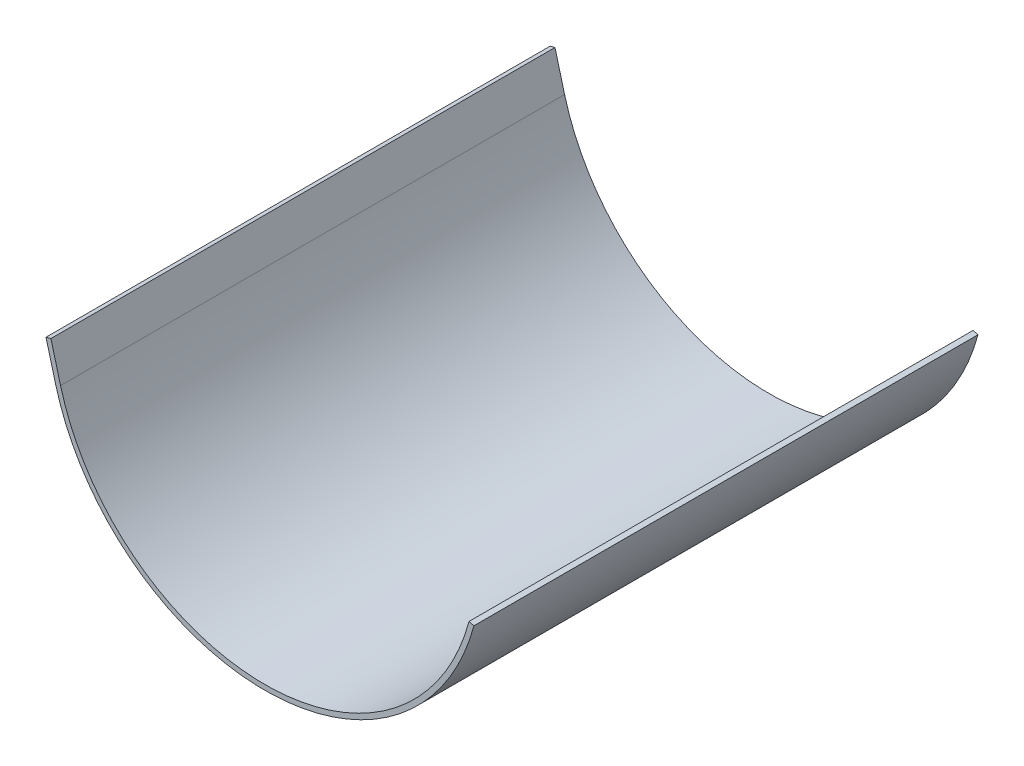
ISO-10303-21;
HEADER;
FILE_DESCRIPTION(('STEP AP214'),'2;1');
FILE_NAME('part.step','',(''),(''),'','','');
FILE_SCHEMA(('AUTOMOTIVE_DESIGN { 1 0 10303 214 1 1 1 1 }'));
ENDSEC;
DATA;
#1=APPLICATION_CONTEXT('core data for automotive mechanical design processes');
#2=APPLICATION_PROTOCOL_DEFINITION('international standard','automotive_design',2000,#1);
#3=PRODUCT_CONTEXT('',#1,'mechanical');
#4=PRODUCT('Part','Part','',(#3));
#5=PRODUCT_RELATED_PRODUCT_CATEGORY('part','',(#4));
#6=PRODUCT_DEFINITION_FORMATION('','',#4);
#7=PRODUCT_DEFINITION_CONTEXT('part definition',#1,'design');
#8=PRODUCT_DEFINITION('design','',#6,#7);
#9=PRODUCT_DEFINITION_SHAPE('','',#8);
#10=(LENGTH_UNIT() NAMED_UNIT(*) SI_UNIT(.MILLI.,.METRE.));
#11=(NAMED_UNIT(*) PLANE_ANGLE_UNIT() SI_UNIT($,.RADIAN.));
#12=(NAMED_UNIT(*) SI_UNIT($,.STERADIAN.) SOLID_ANGLE_UNIT());
#13=UNCERTAINTY_MEASURE_WITH_UNIT(LENGTH_MEASURE(1.E-05),#10,'distance_accuracy_value','');
#14=(GEOMETRIC_REPRESENTATION_CONTEXT(3) GLOBAL_UNCERTAINTY_ASSIGNED_CONTEXT((#13)) GLOBAL_UNIT_ASSIGNED_CONTEXT((#10,
#11,#12)) REPRESENTATION_CONTEXT('',''));
#15=CARTESIAN_POINT('',(0.,0.,0.));
#16=DIRECTION('',(0.,0.,1.));
#17=DIRECTION('',(1.,0.,0.));
#18=AXIS2_PLACEMENT_3D('',#15,#16,#17);
#19=CARTESIAN_POINT('',(0.,0.,74.5));
#20=DIRECTION('',(0.,0.,-1.));
#21=DIRECTION('',(-1.,0.,0.));
#22=AXIS2_PLACEMENT_3D('',#19,#20,#21);
#23=CYLINDRICAL_SURFACE('',#22,62.5);
#24=CARTESIAN_POINT('',(0.,0.,-74.5));
#25=DIRECTION('',(0.,0.,-1.));
#26=DIRECTION('',(1.,0.,0.));
#27=AXIS2_PLACEMENT_3D('',#24,#25,#26);
#28=CIRCLE('',#27,62.5);
#29=CARTESIAN_POINT('',(60.3703641430668,-16.1761903189075,-74.5));
#30=VERTEX_POINT('',#29);
#31=CARTESIAN_POINT('',(-60.3703641430668,-16.1761903189075,-74.5));
#32=VERTEX_POINT('',#31);
#33=EDGE_CURVE('E114',#30,#32,#28,.T.);
#34=ORIENTED_EDGE('',*,*,#33,.T.);
#35=DIRECTION('',(0.,0.,-1.));
#36=VECTOR('',#35,1.);
#37=CARTESIAN_POINT('',(-60.3703641430668,-16.1761903189075,74.5));
#38=LINE('',#37,#36);
#39=CARTESIAN_POINT('',(-60.3703641430668,-16.1761903189075,74.5));
#40=VERTEX_POINT('',#39);
#41=EDGE_CURVE('E11',#40,#32,#38,.T.);
#42=ORIENTED_EDGE('',*,*,#41,.F.);
#43=CARTESIAN_POINT('',(0.,0.,74.5));
#44=DIRECTION('',(0.,0.,-1.));
#45=DIRECTION('',(1.,0.,0.));
#46=AXIS2_PLACEMENT_3D('',#43,#44,#45);
#47=CIRCLE('',#46,62.5);
#48=CARTESIAN_POINT('',(60.3703641430668,-16.1761903189075,74.5));
#49=VERTEX_POINT('',#48);
#50=EDGE_CURVE('E75',#49,#40,#47,.T.);
#51=ORIENTED_EDGE('',*,*,#50,.F.);
#52=DIRECTION('',(0.,0.,-1.));
#53=VECTOR('',#52,1.);
#54=CARTESIAN_POINT('',(60.3703641430668,-16.1761903189075,74.5));
#55=LINE('',#54,#53);
#56=EDGE_CURVE('E124',#49,#30,#55,.T.);
#57=ORIENTED_EDGE('',*,*,#56,.T.);
#58=EDGE_LOOP('',(#34,#42,#51,#57));
#59=FACE_BOUND('',#58,.T.);
#60=ADVANCED_FACE('F33',(#59),#23,.F.);
#61=CARTESIAN_POINT('',(0.,0.,74.5));
#62=DIRECTION('',(0.,0.,-1.));
#63=DIRECTION('',(-1.,0.,0.));
#64=AXIS2_PLACEMENT_3D('',#61,#62,#63);
#65=CYLINDRICAL_SURFACE('',#64,64.0000000000001);
#66=CARTESIAN_POINT('',(0.,0.,-74.5));
#67=DIRECTION('',(0.,0.,1.));
#68=DIRECTION('',(1.,0.,0.));
#69=AXIS2_PLACEMENT_3D('',#66,#67,#68);
#70=CIRCLE('',#69,64.0000000000001);
#71=CARTESIAN_POINT('',(-61.8192528825005,-16.5644188865614,-74.5));
#72=VERTEX_POINT('',#71);
#73=CARTESIAN_POINT('',(61.8192528825005,-16.5644188865614,-74.5));
#74=VERTEX_POINT('',#73);
#75=EDGE_CURVE('E64',#72,#74,#70,.T.);
#76=ORIENTED_EDGE('',*,*,#75,.T.);
#77=DIRECTION('',(0.,0.,-1.));
#78=VECTOR('',#77,1.);
#79=CARTESIAN_POINT('',(61.8192528825005,-16.5644188865614,74.5));
#80=LINE('',#79,#78);
#81=CARTESIAN_POINT('',(61.8192528825005,-16.5644188865614,74.5));
#82=VERTEX_POINT('',#81);
#83=EDGE_CURVE('E129',#82,#74,#80,.T.);
#84=ORIENTED_EDGE('',*,*,#83,.F.);
#85=CARTESIAN_POINT('',(0.,0.,74.5));
#86=DIRECTION('',(0.,0.,1.));
#87=DIRECTION('',(1.,0.,0.));
#88=AXIS2_PLACEMENT_3D('',#85,#86,#87);
#89=CIRCLE('',#88,64.0000000000001);
#90=CARTESIAN_POINT('',(-61.8192528825005,-16.5644188865613,74.5));
#91=VERTEX_POINT('',#90);
#92=EDGE_CURVE('E122',#91,#82,#89,.T.);
#93=ORIENTED_EDGE('',*,*,#92,.F.);
#94=DIRECTION('',(0.,0.,-1.));
#95=VECTOR('',#94,1.);
#96=CARTESIAN_POINT('',(-61.8192528825005,-16.5644188865613,74.5));
#97=LINE('',#96,#95);
#98=EDGE_CURVE('E41',#91,#72,#97,.T.);
#99=ORIENTED_EDGE('',*,*,#98,.T.);
#100=EDGE_LOOP('',(#76,#84,#93,#99));
#101=FACE_BOUND('',#100,.T.);
#102=ADVANCED_FACE('F130',(#101),#65,.T.);
#103=CARTESIAN_POINT('',(61.8192528825005,-16.5644188865613,74.5));
#104=DIRECTION('',(-0.258819045102521,-0.965925826289068,0.));
#105=DIRECTION('',(0.965925826289068,-0.258819045102521,0.));
#106=AXIS2_PLACEMENT_3D('',#103,#104,#105);
#107=PLANE('',#106);
#108=DIRECTION('',(-0.965925826289068,0.258819045102521,0.));
#109=VECTOR('',#108,1.);
#110=CARTESIAN_POINT('',(61.8192528825005,-16.5644188865613,-74.5));
#111=LINE('',#110,#109);
#112=EDGE_CURVE('E70',#74,#30,#111,.T.);
#113=ORIENTED_EDGE('',*,*,#112,.T.);
#114=ORIENTED_EDGE('',*,*,#56,.F.);
#115=DIRECTION('',(-0.965925826289068,0.258819045102521,0.));
#116=VECTOR('',#115,1.);
#117=CARTESIAN_POINT('',(61.8192528825005,-16.5644188865613,74.5));
#118=LINE('',#117,#116);
#119=EDGE_CURVE('E49',#82,#49,#118,.T.);
#120=ORIENTED_EDGE('',*,*,#119,.F.);
#121=ORIENTED_EDGE('',*,*,#83,.T.);
#122=EDGE_LOOP('',(#113,#114,#120,#121));
#123=FACE_BOUND('',#122,.T.);
#124=ADVANCED_FACE('F149',(#123),#107,.F.);
#125=CARTESIAN_POINT('',(0.,0.,74.5));
#126=DIRECTION('',(0.,0.,1.));
#127=DIRECTION('',(1.,0.,0.));
#128=AXIS2_PLACEMENT_3D('',#125,#126,#127);
#129=PLANE('',#128);
#130=ORIENTED_EDGE('',*,*,#50,.T.);
#131=DIRECTION('',(0.258819045102521,-0.965925826289068,0.));
#132=VECTOR('',#131,1.);
#133=CARTESIAN_POINT('',(-63.2173736391945,-5.55100622972783,74.5));
#134=LINE('',#133,#132);
#135=CARTESIAN_POINT('',(-63.2173736391945,-5.55100622972783,74.5));
#136=VERTEX_POINT('',#135);
#137=EDGE_CURVE('E99',#136,#40,#134,.T.);
#138=ORIENTED_EDGE('',*,*,#137,.F.);
#139=DIRECTION('',(0.965925826289068,0.258819045102521,0.));
#140=VECTOR('',#139,1.);
#141=CARTESIAN_POINT('',(-64.6662623786282,-5.93923479738163,74.5));
#142=LINE('',#141,#140);
#143=CARTESIAN_POINT('',(-64.6662623786282,-5.93923479738163,74.5));
#144=VERTEX_POINT('',#143);
#145=EDGE_CURVE('E92',#144,#136,#142,.T.);
#146=ORIENTED_EDGE('',*,*,#145,.F.);
#147=DIRECTION('',(0.258819045102521,-0.965925826289068,0.));
#148=VECTOR('',#147,1.);
#149=CARTESIAN_POINT('',(-64.6662623786282,-5.93923479738163,74.5));
#150=LINE('',#149,#148);
#151=EDGE_CURVE('E96',#144,#91,#150,.T.);
#152=ORIENTED_EDGE('',*,*,#151,.T.);
#153=ORIENTED_EDGE('',*,*,#92,.T.);
#154=ORIENTED_EDGE('',*,*,#119,.T.);
#155=EDGE_LOOP('',(#130,#138,#146,#152,#153,#154));
#156=FACE_BOUND('',#155,.T.);
#157=ADVANCED_FACE('F94',(#156),#129,.T.);
#158=CARTESIAN_POINT('',(0.,0.,-74.5));
#159=DIRECTION('',(0.,0.,1.));
#160=DIRECTION('',(1.,0.,0.));
#161=AXIS2_PLACEMENT_3D('',#158,#159,#160);
#162=PLANE('',#161);
#163=ORIENTED_EDGE('',*,*,#33,.F.);
#164=ORIENTED_EDGE('',*,*,#112,.F.);
#165=ORIENTED_EDGE('',*,*,#75,.F.);
#166=DIRECTION('',(0.258819045102521,-0.965925826289068,0.));
#167=VECTOR('',#166,1.);
#168=CARTESIAN_POINT('',(-64.6662623786282,-5.93923479738163,-74.5));
#169=LINE('',#168,#167);
#170=CARTESIAN_POINT('',(-64.6662623786282,-5.93923479738163,-74.5));
#171=VERTEX_POINT('',#170);
#172=EDGE_CURVE('E131',#171,#72,#169,.T.);
#173=ORIENTED_EDGE('',*,*,#172,.F.);
#174=DIRECTION('',(-0.965925826289068,-0.258819045102521,0.));
#175=VECTOR('',#174,1.);
#176=CARTESIAN_POINT('',(-64.6662623786282,-5.93923479738163,-74.5));
#177=LINE('',#176,#175);
#178=CARTESIAN_POINT('',(-63.2173736391945,-5.55100622972783,-74.5));
#179=VERTEX_POINT('',#178);
#180=EDGE_CURVE('E108',#179,#171,#177,.T.);
#181=ORIENTED_EDGE('',*,*,#180,.F.);
#182=DIRECTION('',(0.258819045102521,-0.965925826289068,0.));
#183=VECTOR('',#182,1.);
#184=CARTESIAN_POINT('',(-63.2173736391945,-5.55100622972783,-74.5));
#185=LINE('',#184,#183);
#186=EDGE_CURVE('E117',#179,#32,#185,.T.);
#187=ORIENTED_EDGE('',*,*,#186,.T.);
#188=EDGE_LOOP('',(#163,#164,#165,#173,#181,#187));
#189=FACE_BOUND('',#188,.T.);
#190=ADVANCED_FACE('F141',(#189),#162,.F.);
#191=CARTESIAN_POINT('',(-64.6662623786282,-5.93923479738163,-74.5));
#192=DIRECTION('',(0.965925826289068,0.258819045102521,0.));
#193=DIRECTION('',(-0.258819045102521,0.965925826289068,0.));
#194=AXIS2_PLACEMENT_3D('',#191,#192,#193);
#195=PLANE('',#194);
#196=ORIENTED_EDGE('',*,*,#98,.F.);
#197=ORIENTED_EDGE('',*,*,#151,.F.);
#198=DIRECTION('',(0.,0.,1.));
#199=VECTOR('',#198,1.);
#200=CARTESIAN_POINT('',(-64.6662623786282,-5.93923479738163,-74.5));
#201=LINE('',#200,#199);
#202=EDGE_CURVE('E103',#171,#144,#201,.T.);
#203=ORIENTED_EDGE('',*,*,#202,.F.);
#204=ORIENTED_EDGE('',*,*,#172,.T.);
#205=EDGE_LOOP('',(#196,#197,#203,#204));
#206=FACE_BOUND('',#205,.T.);
#207=ADVANCED_FACE('F113',(#206),#195,.F.);
#208=CARTESIAN_POINT('',(-63.2173736391945,-5.55100622972783,-74.5));
#209=DIRECTION('',(-0.965925826289068,-0.258819045102521,0.));
#210=DIRECTION('',(0.258819045102521,-0.965925826289068,0.));
#211=AXIS2_PLACEMENT_3D('',#208,#209,#210);
#212=PLANE('',#211);
#213=ORIENTED_EDGE('',*,*,#41,.T.);
#214=ORIENTED_EDGE('',*,*,#186,.F.);
#215=DIRECTION('',(0.,0.,-1.));
#216=VECTOR('',#215,1.);
#217=CARTESIAN_POINT('',(-63.2173736391945,-5.55100622972783,-74.5));
#218=LINE('',#217,#216);
#219=EDGE_CURVE('E102',#136,#179,#218,.T.);
#220=ORIENTED_EDGE('',*,*,#219,.F.);
#221=ORIENTED_EDGE('',*,*,#137,.T.);
#222=EDGE_LOOP('',(#213,#214,#220,#221));
#223=FACE_BOUND('',#222,.T.);
#224=ADVANCED_FACE('F139',(#223),#212,.F.);
#225=CARTESIAN_POINT('',(-2.84700949612773,10.6251840891798,0.));
#226=DIRECTION('',(-0.258819045102521,0.965925826289068,0.));
#227=DIRECTION('',(-0.965925826289068,-0.258819045102521,0.));
#228=AXIS2_PLACEMENT_3D('',#225,#226,#227);
#229=PLANE('',#228);
#230=ORIENTED_EDGE('',*,*,#202,.T.);
#231=ORIENTED_EDGE('',*,*,#145,.T.);
#232=ORIENTED_EDGE('',*,*,#219,.T.);
#233=ORIENTED_EDGE('',*,*,#180,.T.);
#234=EDGE_LOOP('',(#230,#231,#232,#233));
#235=FACE_BOUND('',#234,.T.);
#236=ADVANCED_FACE('F106',(#235),#229,.T.);
#237=CLOSED_SHELL('',(#60,#102,#124,#157,#190,#207,#224,#236));
#238=MANIFOLD_SOLID_BREP('B2',#237);
#239=ADVANCED_BREP_SHAPE_REPRESENTATION('',(#18,#238),#14);
#240=SHAPE_DEFINITION_REPRESENTATION(#9,#239);
ENDSEC;
END-ISO-10303-21;
